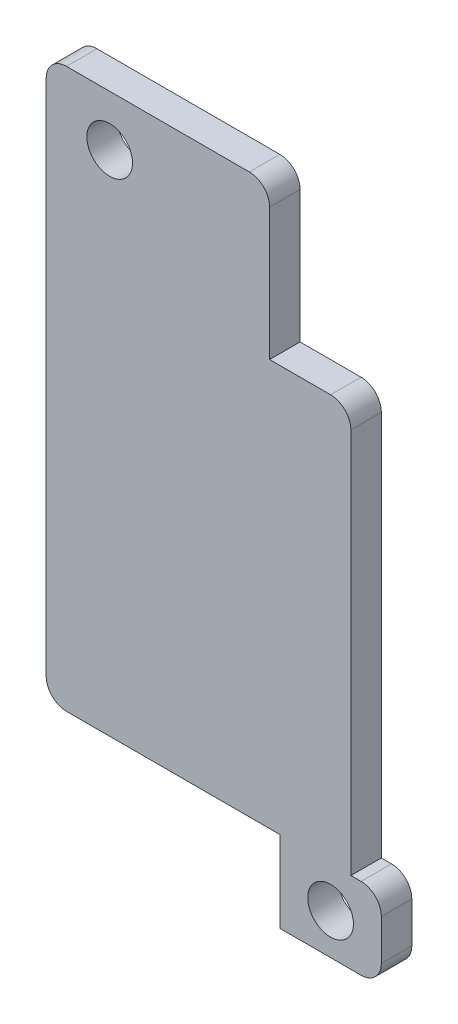
ISO-10303-21;
HEADER;
FILE_DESCRIPTION(('STEP AP214'),'2;1');
FILE_NAME('part.step','',(''),(''),'','','');
FILE_SCHEMA(('AUTOMOTIVE_DESIGN { 1 0 10303 214 1 1 1 1 }'));
ENDSEC;
DATA;
#1=APPLICATION_CONTEXT('core data for automotive mechanical design processes');
#2=APPLICATION_PROTOCOL_DEFINITION('international standard','automotive_design',2000,#1);
#3=PRODUCT_CONTEXT('',#1,'mechanical');
#4=PRODUCT('Part','Part','',(#3));
#5=PRODUCT_RELATED_PRODUCT_CATEGORY('part','',(#4));
#6=PRODUCT_DEFINITION_FORMATION('','',#4);
#7=PRODUCT_DEFINITION_CONTEXT('part definition',#1,'design');
#8=PRODUCT_DEFINITION('design','',#6,#7);
#9=PRODUCT_DEFINITION_SHAPE('','',#8);
#10=(LENGTH_UNIT() NAMED_UNIT(*) SI_UNIT(.MILLI.,.METRE.));
#11=(NAMED_UNIT(*) PLANE_ANGLE_UNIT() SI_UNIT($,.RADIAN.));
#12=(NAMED_UNIT(*) SI_UNIT($,.STERADIAN.) SOLID_ANGLE_UNIT());
#13=UNCERTAINTY_MEASURE_WITH_UNIT(LENGTH_MEASURE(1.E-05),#10,'distance_accuracy_value','');
#14=(GEOMETRIC_REPRESENTATION_CONTEXT(3) GLOBAL_UNCERTAINTY_ASSIGNED_CONTEXT((#13)) GLOBAL_UNIT_ASSIGNED_CONTEXT((#10,
#11,#12)) REPRESENTATION_CONTEXT('',''));
#15=CARTESIAN_POINT('',(0.,0.,0.));
#16=DIRECTION('',(0.,0.,1.));
#17=DIRECTION('',(1.,0.,0.));
#18=AXIS2_PLACEMENT_3D('',#15,#16,#17);
#19=CARTESIAN_POINT('',(15.9441176470588,16.0014705882353,1.5));
#20=DIRECTION('',(-1.,0.,0.));
#21=DIRECTION('',(0.,-1.,0.));
#22=AXIS2_PLACEMENT_3D('',#19,#20,#21);
#23=PLANE('',#22);
#24=DIRECTION('',(0.,1.,0.));
#25=VECTOR('',#24,1.);
#26=CARTESIAN_POINT('',(15.9441176470588,16.0014705882353,-1.5));
#27=LINE('',#26,#25);
#28=CARTESIAN_POINT('',(15.9441176470588,-38.9985294117647,-1.5));
#29=VERTEX_POINT('',#28);
#30=CARTESIAN_POINT('',(15.9441176470588,-0.998529411764711,-1.5));
#31=VERTEX_POINT('',#30);
#32=EDGE_CURVE('E226',#29,#31,#27,.T.);
#33=ORIENTED_EDGE('',*,*,#32,.T.);
#34=DIRECTION('',(0.,0.,1.));
#35=VECTOR('',#34,1.);
#36=CARTESIAN_POINT('',(15.9441176470588,-0.998529411764711,1.5));
#37=LINE('',#36,#35);
#38=CARTESIAN_POINT('',(15.9441176470588,-0.998529411764711,1.5));
#39=VERTEX_POINT('',#38);
#40=EDGE_CURVE('E168',#31,#39,#37,.T.);
#41=ORIENTED_EDGE('',*,*,#40,.T.);
#42=DIRECTION('',(0.,1.,0.));
#43=VECTOR('',#42,1.);
#44=CARTESIAN_POINT('',(15.9441176470588,16.0014705882353,1.5));
#45=LINE('',#44,#43);
#46=CARTESIAN_POINT('',(15.9441176470588,-38.9985294117647,1.5));
#47=VERTEX_POINT('',#46);
#48=EDGE_CURVE('E154',#47,#39,#45,.T.);
#49=ORIENTED_EDGE('',*,*,#48,.F.);
#50=DIRECTION('',(0.,0.,1.));
#51=VECTOR('',#50,1.);
#52=CARTESIAN_POINT('',(15.9441176470588,-38.9985294117647,1.5));
#53=LINE('',#52,#51);
#54=EDGE_CURVE('E166',#29,#47,#53,.T.);
#55=ORIENTED_EDGE('',*,*,#54,.F.);
#56=EDGE_LOOP('',(#33,#41,#49,#55));
#57=FACE_BOUND('',#56,.T.);
#58=ADVANCED_FACE('F39',(#57),#23,.F.);
#59=CARTESIAN_POINT('',(-14.0558823529412,-38.9985294117647,1.5));
#60=DIRECTION('',(0.,1.,0.));
#61=DIRECTION('',(0.,0.,1.));
#62=AXIS2_PLACEMENT_3D('',#59,#60,#61);
#63=PLANE('',#62);
#64=DIRECTION('',(1.,0.,0.));
#65=VECTOR('',#64,1.);
#66=CARTESIAN_POINT('',(-14.0558823529412,-38.9985294117647,1.5));
#67=LINE('',#66,#65);
#68=CARTESIAN_POINT('',(-12.0558823529412,-38.9985294117647,1.5));
#69=VERTEX_POINT('',#68);
#70=CARTESIAN_POINT('',(8.94411764705883,-38.9985294117647,1.5));
#71=VERTEX_POINT('',#70);
#72=EDGE_CURVE('E170',#69,#71,#67,.T.);
#73=ORIENTED_EDGE('',*,*,#72,.F.);
#74=DIRECTION('',(0.,0.,-1.));
#75=VECTOR('',#74,1.);
#76=CARTESIAN_POINT('',(-12.0558823529412,-38.9985294117647,1.5));
#77=LINE('',#76,#75);
#78=CARTESIAN_POINT('',(-12.0558823529412,-38.9985294117647,-1.5));
#79=VERTEX_POINT('',#78);
#80=EDGE_CURVE('E271',#69,#79,#77,.T.);
#81=ORIENTED_EDGE('',*,*,#80,.T.);
#82=DIRECTION('',(1.,0.,0.));
#83=VECTOR('',#82,1.);
#84=CARTESIAN_POINT('',(-14.0558823529412,-38.9985294117647,-1.5));
#85=LINE('',#84,#83);
#86=CARTESIAN_POINT('',(8.94411764705883,-38.9985294117647,-1.5));
#87=VERTEX_POINT('',#86);
#88=EDGE_CURVE('E224',#79,#87,#85,.T.);
#89=ORIENTED_EDGE('',*,*,#88,.T.);
#90=DIRECTION('',(0.,0.,-1.));
#91=VECTOR('',#90,1.);
#92=CARTESIAN_POINT('',(8.94411764705883,-38.9985294117647,-1.5));
#93=LINE('',#92,#91);
#94=EDGE_CURVE('E185',#71,#87,#93,.T.);
#95=ORIENTED_EDGE('',*,*,#94,.F.);
#96=EDGE_LOOP('',(#73,#81,#89,#95));
#97=FACE_BOUND('',#96,.T.);
#98=ADVANCED_FACE('F293',(#97),#63,.F.);
#99=CARTESIAN_POINT('',(-14.0558823529412,16.0014705882353,1.5));
#100=DIRECTION('',(1.,0.,0.));
#101=DIRECTION('',(0.,1.,0.));
#102=AXIS2_PLACEMENT_3D('',#99,#100,#101);
#103=PLANE('',#102);
#104=DIRECTION('',(0.,-1.,0.));
#105=VECTOR('',#104,1.);
#106=CARTESIAN_POINT('',(-14.0558823529412,16.0014705882353,-1.5));
#107=LINE('',#106,#105);
#108=CARTESIAN_POINT('',(-14.0558823529412,14.0014705882353,-1.5));
#109=VERTEX_POINT('',#108);
#110=CARTESIAN_POINT('',(-14.0558823529412,-36.9985294117647,-1.5));
#111=VERTEX_POINT('',#110);
#112=EDGE_CURVE('E213',#109,#111,#107,.T.);
#113=ORIENTED_EDGE('',*,*,#112,.T.);
#114=DIRECTION('',(0.,0.,-1.));
#115=VECTOR('',#114,1.);
#116=CARTESIAN_POINT('',(-14.0558823529412,-36.9985294117647,1.5));
#117=LINE('',#116,#115);
#118=CARTESIAN_POINT('',(-14.0558823529412,-36.9985294117647,1.5));
#119=VERTEX_POINT('',#118);
#120=EDGE_CURVE('E11',#111,#119,#117,.F.);
#121=ORIENTED_EDGE('',*,*,#120,.T.);
#122=DIRECTION('',(0.,-1.,0.));
#123=VECTOR('',#122,1.);
#124=CARTESIAN_POINT('',(-14.0558823529412,16.0014705882353,1.5));
#125=LINE('',#124,#123);
#126=CARTESIAN_POINT('',(-14.0558823529412,14.0014705882353,1.5));
#127=VERTEX_POINT('',#126);
#128=EDGE_CURVE('E214',#127,#119,#125,.T.);
#129=ORIENTED_EDGE('',*,*,#128,.F.);
#130=DIRECTION('',(0.,0.,-1.));
#131=VECTOR('',#130,1.);
#132=CARTESIAN_POINT('',(-14.0558823529412,14.0014705882353,1.5));
#133=LINE('',#132,#131);
#134=EDGE_CURVE('E47',#127,#109,#133,.T.);
#135=ORIENTED_EDGE('',*,*,#134,.T.);
#136=EDGE_LOOP('',(#113,#121,#129,#135));
#137=FACE_BOUND('',#136,.T.);
#138=ADVANCED_FACE('F278',(#137),#103,.F.);
#139=CARTESIAN_POINT('',(-14.0558823529412,16.0014705882353,1.5));
#140=DIRECTION('',(0.,-1.,0.));
#141=DIRECTION('',(0.,0.,-1.));
#142=AXIS2_PLACEMENT_3D('',#139,#140,#141);
#143=PLANE('',#142);
#144=DIRECTION('',(-1.,0.,0.));
#145=VECTOR('',#144,1.);
#146=CARTESIAN_POINT('',(-14.0558823529412,16.0014705882353,1.5));
#147=LINE('',#146,#145);
#148=CARTESIAN_POINT('',(5.94411764705883,16.0014705882353,1.5));
#149=VERTEX_POINT('',#148);
#150=CARTESIAN_POINT('',(-12.0558823529412,16.0014705882353,1.5));
#151=VERTEX_POINT('',#150);
#152=EDGE_CURVE('E169',#149,#151,#147,.T.);
#153=ORIENTED_EDGE('',*,*,#152,.F.);
#154=DIRECTION('',(0.,0.,1.));
#155=VECTOR('',#154,1.);
#156=CARTESIAN_POINT('',(5.94411764705883,16.0014705882353,1.5));
#157=LINE('',#156,#155);
#158=CARTESIAN_POINT('',(5.94411764705883,16.0014705882353,-1.5));
#159=VERTEX_POINT('',#158);
#160=EDGE_CURVE('E269',#149,#159,#157,.F.);
#161=ORIENTED_EDGE('',*,*,#160,.T.);
#162=DIRECTION('',(-1.,0.,0.));
#163=VECTOR('',#162,1.);
#164=CARTESIAN_POINT('',(-14.0558823529412,16.0014705882353,-1.5));
#165=LINE('',#164,#163);
#166=CARTESIAN_POINT('',(-12.0558823529412,16.0014705882353,-1.5));
#167=VERTEX_POINT('',#166);
#168=EDGE_CURVE('E217',#159,#167,#165,.T.);
#169=ORIENTED_EDGE('',*,*,#168,.T.);
#170=DIRECTION('',(0.,0.,-1.));
#171=VECTOR('',#170,1.);
#172=CARTESIAN_POINT('',(-12.0558823529412,16.0014705882353,1.5));
#173=LINE('',#172,#171);
#174=EDGE_CURVE('E267',#167,#151,#173,.F.);
#175=ORIENTED_EDGE('',*,*,#174,.T.);
#176=EDGE_LOOP('',(#153,#161,#169,#175));
#177=FACE_BOUND('',#176,.T.);
#178=ADVANCED_FACE('F300',(#177),#143,.F.);
#179=CARTESIAN_POINT('',(0.,0.,1.5));
#180=DIRECTION('',(0.,0.,1.));
#181=DIRECTION('',(1.,0.,0.));
#182=AXIS2_PLACEMENT_3D('',#179,#180,#181);
#183=PLANE('',#182);
#184=CARTESIAN_POINT('',(-7.80588235294117,11.0014705882353,1.5));
#185=DIRECTION('',(0.,0.,1.));
#186=DIRECTION('',(1.,0.,0.));
#187=AXIS2_PLACEMENT_3D('',#184,#185,#186);
#188=CIRCLE('',#187,2.25);
#189=CARTESIAN_POINT('',(-5.55588235294117,11.0014705882353,1.5));
#190=VERTEX_POINT('',#189);
#191=EDGE_CURVE('E528',#190,#190,#188,.T.);
#192=ORIENTED_EDGE('',*,*,#191,.F.);
#193=EDGE_LOOP('',(#192));
#194=FACE_BOUND('',#193,.T.);
#195=CARTESIAN_POINT('',(13.9441176470588,-42.9985294117647,1.5));
#196=DIRECTION('',(0.,0.,1.));
#197=DIRECTION('',(1.,0.,0.));
#198=AXIS2_PLACEMENT_3D('',#195,#196,#197);
#199=CIRCLE('',#198,2.25);
#200=CARTESIAN_POINT('',(16.1941176470588,-42.9985294117647,1.5));
#201=VERTEX_POINT('',#200);
#202=EDGE_CURVE('E180',#201,#201,#199,.T.);
#203=ORIENTED_EDGE('',*,*,#202,.F.);
#204=EDGE_LOOP('',(#203));
#205=FACE_BOUND('',#204,.T.);
#206=DIRECTION('',(-1.,0.,0.));
#207=VECTOR('',#206,1.);
#208=CARTESIAN_POINT('',(15.9441176470588,-46.9985294117647,1.5));
#209=LINE('',#208,#207);
#210=CARTESIAN_POINT('',(16.9441176470588,-46.9985294117647,1.5));
#211=VERTEX_POINT('',#210);
#212=CARTESIAN_POINT('',(8.94411764705883,-46.9985294117647,1.5));
#213=VERTEX_POINT('',#212);
#214=EDGE_CURVE('E186',#211,#213,#209,.T.);
#215=ORIENTED_EDGE('',*,*,#214,.F.);
#216=CARTESIAN_POINT('',(16.9441176470588,-44.9985294117647,1.5));
#217=DIRECTION('',(0.,0.,1.));
#218=DIRECTION('',(1.,0.,0.));
#219=AXIS2_PLACEMENT_3D('',#216,#217,#218);
#220=CIRCLE('',#219,2.);
#221=CARTESIAN_POINT('',(18.9441176470588,-44.9985294117647,1.5));
#222=VERTEX_POINT('',#221);
#223=EDGE_CURVE('E257',#211,#222,#220,.T.);
#224=ORIENTED_EDGE('',*,*,#223,.T.);
#225=DIRECTION('',(0.,-1.,0.));
#226=VECTOR('',#225,1.);
#227=CARTESIAN_POINT('',(18.9441176470588,-46.9985294117647,1.5));
#228=LINE('',#227,#226);
#229=CARTESIAN_POINT('',(18.9441176470588,-40.9985294117647,1.5));
#230=VERTEX_POINT('',#229);
#231=EDGE_CURVE('E174',#230,#222,#228,.T.);
#232=ORIENTED_EDGE('',*,*,#231,.F.);
#233=CARTESIAN_POINT('',(16.9441176470588,-40.9985294117647,1.5));
#234=DIRECTION('',(0.,0.,1.));
#235=DIRECTION('',(1.,0.,0.));
#236=AXIS2_PLACEMENT_3D('',#233,#234,#235);
#237=CIRCLE('',#236,2.);
#238=CARTESIAN_POINT('',(16.9441176470588,-38.9985294117647,1.5));
#239=VERTEX_POINT('',#238);
#240=EDGE_CURVE('E156',#230,#239,#237,.T.);
#241=ORIENTED_EDGE('',*,*,#240,.T.);
#242=DIRECTION('',(-1.,0.,0.));
#243=VECTOR('',#242,1.);
#244=CARTESIAN_POINT('',(18.9441176470588,-38.9985294117647,1.5));
#245=LINE('',#244,#243);
#246=EDGE_CURVE('E150',#239,#47,#245,.T.);
#247=ORIENTED_EDGE('',*,*,#246,.T.);
#248=ORIENTED_EDGE('',*,*,#48,.T.);
#249=CARTESIAN_POINT('',(13.9441176470588,-0.998529411764711,1.5));
#250=DIRECTION('',(0.,0.,1.));
#251=DIRECTION('',(1.,0.,0.));
#252=AXIS2_PLACEMENT_3D('',#249,#250,#251);
#253=CIRCLE('',#252,2.);
#254=CARTESIAN_POINT('',(13.9441176470588,1.00147058823529,1.5));
#255=VERTEX_POINT('',#254);
#256=EDGE_CURVE('E54',#39,#255,#253,.T.);
#257=ORIENTED_EDGE('',*,*,#256,.T.);
#258=DIRECTION('',(1.,0.,0.));
#259=VECTOR('',#258,1.);
#260=CARTESIAN_POINT('',(7.94411764705883,1.00147058823529,1.5));
#261=LINE('',#260,#259);
#262=CARTESIAN_POINT('',(7.94411764705883,1.00147058823529,1.5));
#263=VERTEX_POINT('',#262);
#264=EDGE_CURVE('E205',#263,#255,#261,.T.);
#265=ORIENTED_EDGE('',*,*,#264,.F.);
#266=DIRECTION('',(0.,-1.,0.));
#267=VECTOR('',#266,1.);
#268=CARTESIAN_POINT('',(7.94411764705883,16.0014705882353,1.5));
#269=LINE('',#268,#267);
#270=CARTESIAN_POINT('',(7.94411764705883,14.0014705882353,1.5));
#271=VERTEX_POINT('',#270);
#272=EDGE_CURVE('E201',#271,#263,#269,.T.);
#273=ORIENTED_EDGE('',*,*,#272,.F.);
#274=CARTESIAN_POINT('',(5.94411764705883,14.0014705882353,1.5));
#275=DIRECTION('',(0.,0.,1.));
#276=DIRECTION('',(1.,0.,0.));
#277=AXIS2_PLACEMENT_3D('',#274,#275,#276);
#278=CIRCLE('',#277,2.);
#279=EDGE_CURVE('E253',#271,#149,#278,.T.);
#280=ORIENTED_EDGE('',*,*,#279,.T.);
#281=ORIENTED_EDGE('',*,*,#152,.T.);
#282=CARTESIAN_POINT('',(-12.0558823529412,14.0014705882353,1.5));
#283=DIRECTION('',(0.,0.,1.));
#284=DIRECTION('',(1.,0.,0.));
#285=AXIS2_PLACEMENT_3D('',#282,#283,#284);
#286=CIRCLE('',#285,2.);
#287=EDGE_CURVE('E249',#151,#127,#286,.T.);
#288=ORIENTED_EDGE('',*,*,#287,.T.);
#289=ORIENTED_EDGE('',*,*,#128,.T.);
#290=CARTESIAN_POINT('',(-12.0558823529412,-36.9985294117647,1.5));
#291=DIRECTION('',(0.,0.,1.));
#292=DIRECTION('',(1.,0.,0.));
#293=AXIS2_PLACEMENT_3D('',#290,#291,#292);
#294=CIRCLE('',#293,2.);
#295=EDGE_CURVE('E251',#119,#69,#294,.T.);
#296=ORIENTED_EDGE('',*,*,#295,.T.);
#297=ORIENTED_EDGE('',*,*,#72,.T.);
#298=DIRECTION('',(0.,1.,0.));
#299=VECTOR('',#298,1.);
#300=CARTESIAN_POINT('',(8.94411764705883,-46.9985294117647,1.5));
#301=LINE('',#300,#299);
#302=EDGE_CURVE('E198',#213,#71,#301,.T.);
#303=ORIENTED_EDGE('',*,*,#302,.F.);
#304=EDGE_LOOP('',(#215,#224,#232,#241,#247,#248,#257,#265,#273,#280,#281,#288,#289,#296,#297,#303));
#305=FACE_BOUND('',#304,.T.);
#306=ADVANCED_FACE('F153',(#194,#205,#305),#183,.T.);
#307=CARTESIAN_POINT('',(0.,0.,-1.5));
#308=DIRECTION('',(0.,0.,1.));
#309=DIRECTION('',(1.,0.,0.));
#310=AXIS2_PLACEMENT_3D('',#307,#308,#309);
#311=PLANE('',#310);
#312=CARTESIAN_POINT('',(-7.80588235294117,11.0014705882353,-1.5));
#313=DIRECTION('',(0.,0.,1.));
#314=DIRECTION('',(1.,0.,0.));
#315=AXIS2_PLACEMENT_3D('',#312,#313,#314);
#316=CIRCLE('',#315,2.25);
#317=CARTESIAN_POINT('',(-5.55588235294117,11.0014705882353,-1.5));
#318=VERTEX_POINT('',#317);
#319=EDGE_CURVE('E525',#318,#318,#316,.T.);
#320=ORIENTED_EDGE('',*,*,#319,.T.);
#321=EDGE_LOOP('',(#320));
#322=FACE_BOUND('',#321,.T.);
#323=CARTESIAN_POINT('',(13.9441176470588,-42.9985294117647,-1.5));
#324=DIRECTION('',(0.,0.,1.));
#325=DIRECTION('',(1.,0.,0.));
#326=AXIS2_PLACEMENT_3D('',#323,#324,#325);
#327=CIRCLE('',#326,2.25);
#328=CARTESIAN_POINT('',(16.1941176470588,-42.9985294117647,-1.5));
#329=VERTEX_POINT('',#328);
#330=EDGE_CURVE('E175',#329,#329,#327,.T.);
#331=ORIENTED_EDGE('',*,*,#330,.T.);
#332=EDGE_LOOP('',(#331));
#333=FACE_BOUND('',#332,.T.);
#334=DIRECTION('',(0.,1.,0.));
#335=VECTOR('',#334,1.);
#336=CARTESIAN_POINT('',(18.9441176470588,-46.9985294117647,-1.5));
#337=LINE('',#336,#335);
#338=CARTESIAN_POINT('',(18.9441176470588,-44.9985294117647,-1.5));
#339=VERTEX_POINT('',#338);
#340=CARTESIAN_POINT('',(18.9441176470588,-40.9985294117647,-1.5));
#341=VERTEX_POINT('',#340);
#342=EDGE_CURVE('E161',#339,#341,#337,.T.);
#343=ORIENTED_EDGE('',*,*,#342,.F.);
#344=CARTESIAN_POINT('',(16.9441176470588,-44.9985294117647,-1.5));
#345=DIRECTION('',(0.,0.,1.));
#346=DIRECTION('',(1.,0.,0.));
#347=AXIS2_PLACEMENT_3D('',#344,#345,#346);
#348=CIRCLE('',#347,2.);
#349=CARTESIAN_POINT('',(16.9441176470588,-46.9985294117647,-1.5));
#350=VERTEX_POINT('',#349);
#351=EDGE_CURVE('E245',#339,#350,#348,.F.);
#352=ORIENTED_EDGE('',*,*,#351,.T.);
#353=DIRECTION('',(1.,0.,0.));
#354=VECTOR('',#353,1.);
#355=CARTESIAN_POINT('',(15.9441176470588,-46.9985294117647,-1.5));
#356=LINE('',#355,#354);
#357=CARTESIAN_POINT('',(8.94411764705883,-46.9985294117647,-1.5));
#358=VERTEX_POINT('',#357);
#359=EDGE_CURVE('E190',#358,#350,#356,.T.);
#360=ORIENTED_EDGE('',*,*,#359,.F.);
#361=DIRECTION('',(0.,1.,0.));
#362=VECTOR('',#361,1.);
#363=CARTESIAN_POINT('',(8.94411764705883,-46.9985294117647,-1.5));
#364=LINE('',#363,#362);
#365=EDGE_CURVE('E193',#358,#87,#364,.T.);
#366=ORIENTED_EDGE('',*,*,#365,.T.);
#367=ORIENTED_EDGE('',*,*,#88,.F.);
#368=CARTESIAN_POINT('',(-12.0558823529412,-36.9985294117647,-1.5));
#369=DIRECTION('',(0.,0.,1.));
#370=DIRECTION('',(1.,0.,0.));
#371=AXIS2_PLACEMENT_3D('',#368,#369,#370);
#372=CIRCLE('',#371,2.);
#373=EDGE_CURVE('E237',#79,#111,#372,.F.);
#374=ORIENTED_EDGE('',*,*,#373,.T.);
#375=ORIENTED_EDGE('',*,*,#112,.F.);
#376=CARTESIAN_POINT('',(-12.0558823529412,14.0014705882353,-1.5));
#377=DIRECTION('',(0.,0.,1.));
#378=DIRECTION('',(1.,0.,0.));
#379=AXIS2_PLACEMENT_3D('',#376,#377,#378);
#380=CIRCLE('',#379,2.);
#381=EDGE_CURVE('E235',#109,#167,#380,.F.);
#382=ORIENTED_EDGE('',*,*,#381,.T.);
#383=ORIENTED_EDGE('',*,*,#168,.F.);
#384=CARTESIAN_POINT('',(5.94411764705883,14.0014705882353,-1.5));
#385=DIRECTION('',(0.,0.,1.));
#386=DIRECTION('',(1.,0.,0.));
#387=AXIS2_PLACEMENT_3D('',#384,#385,#386);
#388=CIRCLE('',#387,2.);
#389=CARTESIAN_POINT('',(7.94411764705883,14.0014705882353,-1.5));
#390=VERTEX_POINT('',#389);
#391=EDGE_CURVE('E239',#159,#390,#388,.F.);
#392=ORIENTED_EDGE('',*,*,#391,.T.);
#393=DIRECTION('',(0.,-1.,0.));
#394=VECTOR('',#393,1.);
#395=CARTESIAN_POINT('',(7.94411764705883,16.0014705882353,-1.5));
#396=LINE('',#395,#394);
#397=CARTESIAN_POINT('',(7.94411764705883,1.00147058823529,-1.5));
#398=VERTEX_POINT('',#397);
#399=EDGE_CURVE('E202',#390,#398,#396,.T.);
#400=ORIENTED_EDGE('',*,*,#399,.T.);
#401=DIRECTION('',(1.,0.,0.));
#402=VECTOR('',#401,1.);
#403=CARTESIAN_POINT('',(7.94411764705883,1.00147058823529,-1.5));
#404=LINE('',#403,#402);
#405=CARTESIAN_POINT('',(13.9441176470588,1.00147058823529,-1.5));
#406=VERTEX_POINT('',#405);
#407=EDGE_CURVE('E204',#398,#406,#404,.T.);
#408=ORIENTED_EDGE('',*,*,#407,.T.);
#409=CARTESIAN_POINT('',(13.9441176470588,-0.998529411764711,-1.5));
#410=DIRECTION('',(0.,0.,1.));
#411=DIRECTION('',(1.,0.,0.));
#412=AXIS2_PLACEMENT_3D('',#409,#410,#411);
#413=CIRCLE('',#412,2.);
#414=EDGE_CURVE('E241',#406,#31,#413,.F.);
#415=ORIENTED_EDGE('',*,*,#414,.T.);
#416=ORIENTED_EDGE('',*,*,#32,.F.);
#417=DIRECTION('',(-1.,0.,0.));
#418=VECTOR('',#417,1.);
#419=CARTESIAN_POINT('',(18.9441176470588,-38.9985294117647,-1.5));
#420=LINE('',#419,#418);
#421=CARTESIAN_POINT('',(16.9441176470588,-38.9985294117647,-1.5));
#422=VERTEX_POINT('',#421);
#423=EDGE_CURVE('E160',#422,#29,#420,.T.);
#424=ORIENTED_EDGE('',*,*,#423,.F.);
#425=CARTESIAN_POINT('',(16.9441176470588,-40.9985294117647,-1.5));
#426=DIRECTION('',(0.,0.,1.));
#427=DIRECTION('',(1.,0.,0.));
#428=AXIS2_PLACEMENT_3D('',#425,#426,#427);
#429=CIRCLE('',#428,2.);
#430=EDGE_CURVE('E243',#422,#341,#429,.F.);
#431=ORIENTED_EDGE('',*,*,#430,.T.);
#432=EDGE_LOOP('',(#343,#352,#360,#366,#367,#374,#375,#382,#383,#392,#400,#408,#415,#416,#424,#431));
#433=FACE_BOUND('',#432,.T.);
#434=ADVANCED_FACE('F284',(#322,#333,#433),#311,.F.);
#435=CARTESIAN_POINT('',(7.94411764705883,16.0014705882353,-1.5));
#436=DIRECTION('',(-1.,0.,0.));
#437=DIRECTION('',(0.,0.,1.));
#438=AXIS2_PLACEMENT_3D('',#435,#436,#437);
#439=PLANE('',#438);
#440=ORIENTED_EDGE('',*,*,#399,.F.);
#441=DIRECTION('',(0.,0.,1.));
#442=VECTOR('',#441,1.);
#443=CARTESIAN_POINT('',(7.94411764705883,14.0014705882353,-1.5));
#444=LINE('',#443,#442);
#445=EDGE_CURVE('E264',#390,#271,#444,.T.);
#446=ORIENTED_EDGE('',*,*,#445,.T.);
#447=ORIENTED_EDGE('',*,*,#272,.T.);
#448=DIRECTION('',(0.,0.,1.));
#449=VECTOR('',#448,1.);
#450=CARTESIAN_POINT('',(7.94411764705883,1.00147058823529,-1.5));
#451=LINE('',#450,#449);
#452=EDGE_CURVE('E208',#398,#263,#451,.T.);
#453=ORIENTED_EDGE('',*,*,#452,.F.);
#454=EDGE_LOOP('',(#440,#446,#447,#453));
#455=FACE_BOUND('',#454,.T.);
#456=ADVANCED_FACE('F309',(#455),#439,.F.);
#457=CARTESIAN_POINT('',(7.94411764705883,1.00147058823529,-1.5));
#458=DIRECTION('',(0.,-1.,0.));
#459=DIRECTION('',(0.,0.,-1.));
#460=AXIS2_PLACEMENT_3D('',#457,#458,#459);
#461=PLANE('',#460);
#462=ORIENTED_EDGE('',*,*,#264,.T.);
#463=DIRECTION('',(0.,0.,1.));
#464=VECTOR('',#463,1.);
#465=CARTESIAN_POINT('',(13.9441176470588,1.00147058823529,-1.5));
#466=LINE('',#465,#464);
#467=EDGE_CURVE('E262',#255,#406,#466,.F.);
#468=ORIENTED_EDGE('',*,*,#467,.T.);
#469=ORIENTED_EDGE('',*,*,#407,.F.);
#470=ORIENTED_EDGE('',*,*,#452,.T.);
#471=EDGE_LOOP('',(#462,#468,#469,#470));
#472=FACE_BOUND('',#471,.T.);
#473=ADVANCED_FACE('F312',(#472),#461,.F.);
#474=CARTESIAN_POINT('',(8.94411764705883,-46.9985294117647,-1.5));
#475=DIRECTION('',(1.,0.,0.));
#476=DIRECTION('',(0.,0.,-1.));
#477=AXIS2_PLACEMENT_3D('',#474,#475,#476);
#478=PLANE('',#477);
#479=ORIENTED_EDGE('',*,*,#94,.T.);
#480=ORIENTED_EDGE('',*,*,#365,.F.);
#481=DIRECTION('',(0.,0.,-1.));
#482=VECTOR('',#481,1.);
#483=CARTESIAN_POINT('',(8.94411764705883,-46.9985294117647,-1.5));
#484=LINE('',#483,#482);
#485=EDGE_CURVE('E188',#213,#358,#484,.T.);
#486=ORIENTED_EDGE('',*,*,#485,.F.);
#487=ORIENTED_EDGE('',*,*,#302,.T.);
#488=EDGE_LOOP('',(#479,#480,#486,#487));
#489=FACE_BOUND('',#488,.T.);
#490=ADVANCED_FACE('F333',(#489),#478,.F.);
#491=CARTESIAN_POINT('',(0.,-46.9985294117647,0.));
#492=DIRECTION('',(0.,-1.,0.));
#493=DIRECTION('',(0.,0.,-1.));
#494=AXIS2_PLACEMENT_3D('',#491,#492,#493);
#495=PLANE('',#494);
#496=ORIENTED_EDGE('',*,*,#359,.T.);
#497=DIRECTION('',(0.,0.,-1.));
#498=VECTOR('',#497,1.);
#499=CARTESIAN_POINT('',(16.9441176470588,-46.9985294117647,1.5));
#500=LINE('',#499,#498);
#501=EDGE_CURVE('E247',#350,#211,#500,.F.);
#502=ORIENTED_EDGE('',*,*,#501,.T.);
#503=ORIENTED_EDGE('',*,*,#214,.T.);
#504=ORIENTED_EDGE('',*,*,#485,.T.);
#505=EDGE_LOOP('',(#496,#502,#503,#504));
#506=FACE_BOUND('',#505,.T.);
#507=ADVANCED_FACE('F330',(#506),#495,.T.);
#508=CARTESIAN_POINT('',(18.9441176470588,-38.9985294117647,1.5));
#509=DIRECTION('',(0.,-1.,0.));
#510=DIRECTION('',(1.,0.,0.));
#511=AXIS2_PLACEMENT_3D('',#508,#509,#510);
#512=PLANE('',#511);
#513=ORIENTED_EDGE('',*,*,#246,.F.);
#514=DIRECTION('',(0.,0.,1.));
#515=VECTOR('',#514,1.);
#516=CARTESIAN_POINT('',(16.9441176470588,-38.9985294117647,1.5));
#517=LINE('',#516,#515);
#518=EDGE_CURVE('E259',#239,#422,#517,.F.);
#519=ORIENTED_EDGE('',*,*,#518,.T.);
#520=ORIENTED_EDGE('',*,*,#423,.T.);
#521=ORIENTED_EDGE('',*,*,#54,.T.);
#522=EDGE_LOOP('',(#513,#519,#520,#521));
#523=FACE_BOUND('',#522,.T.);
#524=ADVANCED_FACE('F172',(#523),#512,.F.);
#525=CARTESIAN_POINT('',(18.9441176470588,0.,0.));
#526=DIRECTION('',(-1.,0.,0.));
#527=DIRECTION('',(0.,-1.,0.));
#528=AXIS2_PLACEMENT_3D('',#525,#526,#527);
#529=PLANE('',#528);
#530=ORIENTED_EDGE('',*,*,#231,.T.);
#531=DIRECTION('',(0.,0.,-1.));
#532=VECTOR('',#531,1.);
#533=CARTESIAN_POINT('',(18.9441176470588,-44.9985294117647,-1.5));
#534=LINE('',#533,#532);
#535=EDGE_CURVE('E232',#222,#339,#534,.T.);
#536=ORIENTED_EDGE('',*,*,#535,.T.);
#537=ORIENTED_EDGE('',*,*,#342,.T.);
#538=DIRECTION('',(0.,0.,1.));
#539=VECTOR('',#538,1.);
#540=CARTESIAN_POINT('',(18.9441176470588,-40.9985294117647,0.));
#541=LINE('',#540,#539);
#542=EDGE_CURVE('E221',#341,#230,#541,.T.);
#543=ORIENTED_EDGE('',*,*,#542,.T.);
#544=EDGE_LOOP('',(#530,#536,#537,#543));
#545=FACE_BOUND('',#544,.T.);
#546=ADVANCED_FACE('F322',(#545),#529,.F.);
#547=CARTESIAN_POINT('',(13.9441176470588,-42.9985294117647,1.5));
#548=DIRECTION('',(0.,0.,1.));
#549=DIRECTION('',(1.,0.,0.));
#550=AXIS2_PLACEMENT_3D('',#547,#548,#549);
#551=CYLINDRICAL_SURFACE('',#550,2.25);
#552=ORIENTED_EDGE('',*,*,#330,.F.);
#553=EDGE_LOOP('',(#552));
#554=FACE_BOUND('',#553,.T.);
#555=ORIENTED_EDGE('',*,*,#202,.T.);
#556=EDGE_LOOP('',(#555));
#557=FACE_BOUND('',#556,.T.);
#558=ADVANCED_FACE('F406',(#554,#557),#551,.F.);
#559=CARTESIAN_POINT('',(-7.80588235294117,11.0014705882353,1.5));
#560=DIRECTION('',(0.,0.,1.));
#561=DIRECTION('',(1.,0.,0.));
#562=AXIS2_PLACEMENT_3D('',#559,#560,#561);
#563=CYLINDRICAL_SURFACE('',#562,2.25);
#564=ORIENTED_EDGE('',*,*,#319,.F.);
#565=EDGE_LOOP('',(#564));
#566=FACE_BOUND('',#565,.T.);
#567=ORIENTED_EDGE('',*,*,#191,.T.);
#568=EDGE_LOOP('',(#567));
#569=FACE_BOUND('',#568,.T.);
#570=ADVANCED_FACE('F355',(#566,#569),#563,.F.);
#571=CARTESIAN_POINT('',(16.9441176470588,-44.9985294117647,0.));
#572=DIRECTION('',(0.,0.,1.));
#573=DIRECTION('',(1.,0.,0.));
#574=AXIS2_PLACEMENT_3D('',#571,#572,#573);
#575=CYLINDRICAL_SURFACE('',#574,2.);
#576=ORIENTED_EDGE('',*,*,#223,.F.);
#577=ORIENTED_EDGE('',*,*,#501,.F.);
#578=ORIENTED_EDGE('',*,*,#351,.F.);
#579=ORIENTED_EDGE('',*,*,#535,.F.);
#580=EDGE_LOOP('',(#576,#577,#578,#579));
#581=FACE_BOUND('',#580,.T.);
#582=ADVANCED_FACE('F327',(#581),#575,.T.);
#583=CARTESIAN_POINT('',(16.9441176470588,-40.9985294117647,0.));
#584=DIRECTION('',(0.,0.,1.));
#585=DIRECTION('',(1.,0.,0.));
#586=AXIS2_PLACEMENT_3D('',#583,#584,#585);
#587=CYLINDRICAL_SURFACE('',#586,2.);
#588=ORIENTED_EDGE('',*,*,#430,.F.);
#589=ORIENTED_EDGE('',*,*,#518,.F.);
#590=ORIENTED_EDGE('',*,*,#240,.F.);
#591=ORIENTED_EDGE('',*,*,#542,.F.);
#592=EDGE_LOOP('',(#588,#589,#590,#591));
#593=FACE_BOUND('',#592,.T.);
#594=ADVANCED_FACE('F320',(#593),#587,.T.);
#595=CARTESIAN_POINT('',(13.9441176470588,-0.998529411764711,1.5));
#596=DIRECTION('',(0.,0.,1.));
#597=DIRECTION('',(1.,0.,0.));
#598=AXIS2_PLACEMENT_3D('',#595,#596,#597);
#599=CYLINDRICAL_SURFACE('',#598,2.);
#600=ORIENTED_EDGE('',*,*,#414,.F.);
#601=ORIENTED_EDGE('',*,*,#467,.F.);
#602=ORIENTED_EDGE('',*,*,#256,.F.);
#603=ORIENTED_EDGE('',*,*,#40,.F.);
#604=EDGE_LOOP('',(#600,#601,#602,#603));
#605=FACE_BOUND('',#604,.T.);
#606=ADVANCED_FACE('F315',(#605),#599,.T.);
#607=CARTESIAN_POINT('',(5.94411764705883,14.0014705882353,-1.5));
#608=DIRECTION('',(0.,0.,1.));
#609=DIRECTION('',(1.,0.,0.));
#610=AXIS2_PLACEMENT_3D('',#607,#608,#609);
#611=CYLINDRICAL_SURFACE('',#610,2.);
#612=ORIENTED_EDGE('',*,*,#391,.F.);
#613=ORIENTED_EDGE('',*,*,#160,.F.);
#614=ORIENTED_EDGE('',*,*,#279,.F.);
#615=ORIENTED_EDGE('',*,*,#445,.F.);
#616=EDGE_LOOP('',(#612,#613,#614,#615));
#617=FACE_BOUND('',#616,.T.);
#618=ADVANCED_FACE('F306',(#617),#611,.T.);
#619=CARTESIAN_POINT('',(-12.0558823529412,-36.9985294117647,1.5));
#620=DIRECTION('',(0.,0.,-1.));
#621=DIRECTION('',(-1.,0.,0.));
#622=AXIS2_PLACEMENT_3D('',#619,#620,#621);
#623=CYLINDRICAL_SURFACE('',#622,2.);
#624=ORIENTED_EDGE('',*,*,#295,.F.);
#625=ORIENTED_EDGE('',*,*,#120,.F.);
#626=ORIENTED_EDGE('',*,*,#373,.F.);
#627=ORIENTED_EDGE('',*,*,#80,.F.);
#628=EDGE_LOOP('',(#624,#625,#626,#627));
#629=FACE_BOUND('',#628,.T.);
#630=ADVANCED_FACE('F290',(#629),#623,.T.);
#631=CARTESIAN_POINT('',(-12.0558823529412,14.0014705882353,1.5));
#632=DIRECTION('',(0.,0.,-1.));
#633=DIRECTION('',(-1.,0.,0.));
#634=AXIS2_PLACEMENT_3D('',#631,#632,#633);
#635=CYLINDRICAL_SURFACE('',#634,2.);
#636=ORIENTED_EDGE('',*,*,#287,.F.);
#637=ORIENTED_EDGE('',*,*,#174,.F.);
#638=ORIENTED_EDGE('',*,*,#381,.F.);
#639=ORIENTED_EDGE('',*,*,#134,.F.);
#640=EDGE_LOOP('',(#636,#637,#638,#639));
#641=FACE_BOUND('',#640,.T.);
#642=ADVANCED_FACE('F41',(#641),#635,.T.);
#643=CLOSED_SHELL('',(#58,#98,#138,#178,#306,#434,#456,#473,#490,#507,#524,#546,#558,#570,#582,
#594,#606,#618,#630,#642));
#644=MANIFOLD_SOLID_BREP('B2',#643);
#645=ADVANCED_BREP_SHAPE_REPRESENTATION('',(#18,#644),#14);
#646=SHAPE_DEFINITION_REPRESENTATION(#9,#645);
ENDSEC;
END-ISO-10303-21;
